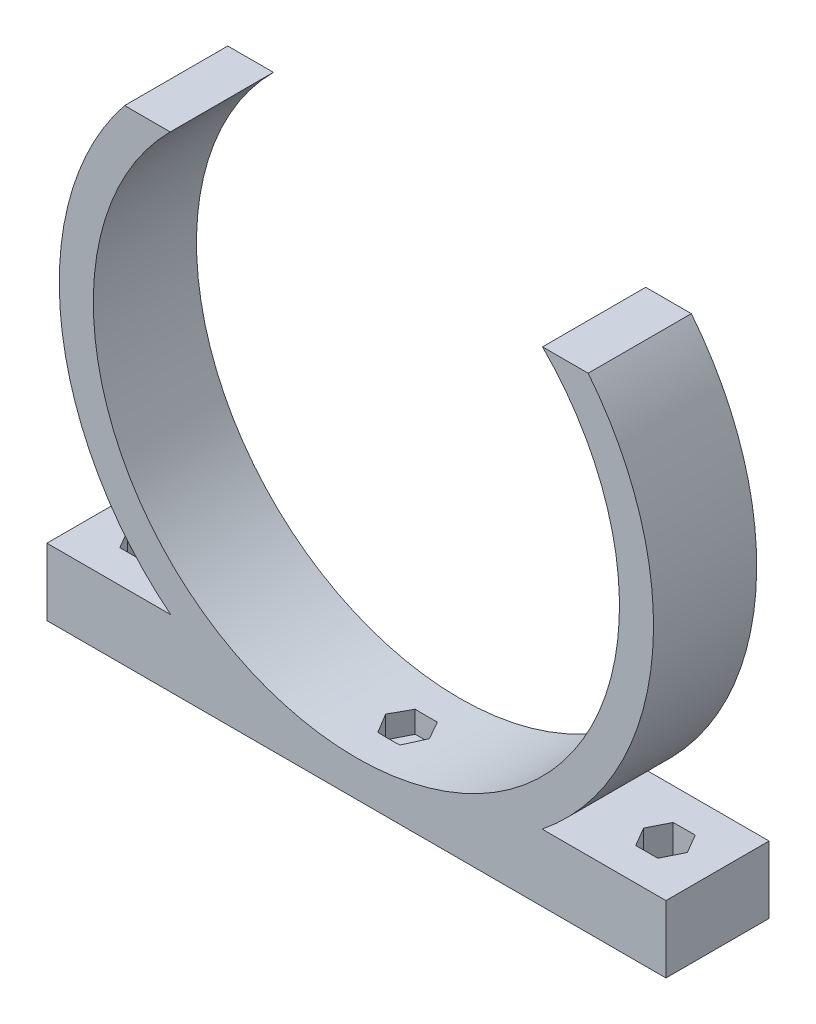
ISO-10303-21;
HEADER;
FILE_DESCRIPTION(('STEP AP214'),'2;1');
FILE_NAME('part.step','',(''),(''),'','','');
FILE_SCHEMA(('AUTOMOTIVE_DESIGN { 1 0 10303 214 1 1 1 1 }'));
ENDSEC;
DATA;
#1=APPLICATION_CONTEXT('core data for automotive mechanical design processes');
#2=APPLICATION_PROTOCOL_DEFINITION('international standard','automotive_design',2000,#1);
#3=PRODUCT_CONTEXT('',#1,'mechanical');
#4=PRODUCT('Part','Part','',(#3));
#5=PRODUCT_RELATED_PRODUCT_CATEGORY('part','',(#4));
#6=PRODUCT_DEFINITION_FORMATION('','',#4);
#7=PRODUCT_DEFINITION_CONTEXT('part definition',#1,'design');
#8=PRODUCT_DEFINITION('design','',#6,#7);
#9=PRODUCT_DEFINITION_SHAPE('','',#8);
#10=(LENGTH_UNIT() NAMED_UNIT(*) SI_UNIT(.MILLI.,.METRE.));
#11=(NAMED_UNIT(*) PLANE_ANGLE_UNIT() SI_UNIT($,.RADIAN.));
#12=(NAMED_UNIT(*) SI_UNIT($,.STERADIAN.) SOLID_ANGLE_UNIT());
#13=UNCERTAINTY_MEASURE_WITH_UNIT(LENGTH_MEASURE(1.E-05),#10,'distance_accuracy_value','');
#14=(GEOMETRIC_REPRESENTATION_CONTEXT(3) GLOBAL_UNCERTAINTY_ASSIGNED_CONTEXT((#13)) GLOBAL_UNIT_ASSIGNED_CONTEXT((#10,
#11,#12)) REPRESENTATION_CONTEXT('',''));
#15=CARTESIAN_POINT('',(0.,0.,0.));
#16=DIRECTION('',(0.,0.,1.));
#17=DIRECTION('',(1.,0.,0.));
#18=AXIS2_PLACEMENT_3D('',#15,#16,#17);
#19=CARTESIAN_POINT('',(0.,12.7,6.35));
#20=DIRECTION('',(0.,-1.,0.));
#21=DIRECTION('',(0.,0.,-1.));
#22=AXIS2_PLACEMENT_3D('',#19,#20,#21);
#23=CYLINDRICAL_SURFACE('',#22,1.27);
#24=CARTESIAN_POINT('',(0.,0.,6.35));
#25=DIRECTION('',(0.,-1.,0.));
#26=DIRECTION('',(0.,0.,-1.));
#27=AXIS2_PLACEMENT_3D('',#24,#25,#26);
#28=CIRCLE('',#27,1.27);
#29=CARTESIAN_POINT('',(0.,0.,5.08));
#30=VERTEX_POINT('',#29);
#31=EDGE_CURVE('E362',#30,#30,#28,.T.);
#32=ORIENTED_EDGE('',*,*,#31,.T.);
#33=EDGE_LOOP('',(#32));
#34=FACE_BOUND('',#33,.T.);
#35=CARTESIAN_POINT('',(0.,1.77799999999999,6.35));
#36=DIRECTION('',(0.,1.,0.));
#37=DIRECTION('',(0.,0.,1.));
#38=AXIS2_PLACEMENT_3D('',#35,#36,#37);
#39=CIRCLE('',#38,1.27);
#40=CARTESIAN_POINT('',(0.,1.77799999999999,7.62));
#41=VERTEX_POINT('',#40);
#42=EDGE_CURVE('E39',#41,#41,#39,.F.);
#43=ORIENTED_EDGE('',*,*,#42,.F.);
#44=EDGE_LOOP('',(#43));
#45=FACE_BOUND('',#44,.T.);
#46=ADVANCED_FACE('F35',(#34,#45),#23,.F.);
#47=CARTESIAN_POINT('',(0.,0.,12.7));
#48=DIRECTION('',(0.,1.,0.));
#49=DIRECTION('',(0.,0.,1.));
#50=AXIS2_PLACEMENT_3D('',#47,#48,#49);
#51=PLANE('',#50);
#52=CARTESIAN_POINT('',(-31.75,0.,6.35));
#53=DIRECTION('',(0.,-1.,0.));
#54=DIRECTION('',(0.,0.,-1.));
#55=AXIS2_PLACEMENT_3D('',#52,#53,#54);
#56=CIRCLE('',#55,1.27);
#57=CARTESIAN_POINT('',(-31.75,0.,5.08));
#58=VERTEX_POINT('',#57);
#59=EDGE_CURVE('E363',#58,#58,#56,.T.);
#60=ORIENTED_EDGE('',*,*,#59,.F.);
#61=EDGE_LOOP('',(#60));
#62=FACE_BOUND('',#61,.T.);
#63=CARTESIAN_POINT('',(31.75,0.,6.35));
#64=DIRECTION('',(0.,-1.,0.));
#65=DIRECTION('',(0.,0.,-1.));
#66=AXIS2_PLACEMENT_3D('',#63,#64,#65);
#67=CIRCLE('',#66,1.27);
#68=CARTESIAN_POINT('',(31.75,0.,5.08));
#69=VERTEX_POINT('',#68);
#70=EDGE_CURVE('E359',#69,#69,#67,.T.);
#71=ORIENTED_EDGE('',*,*,#70,.F.);
#72=EDGE_LOOP('',(#71));
#73=FACE_BOUND('',#72,.T.);
#74=ORIENTED_EDGE('',*,*,#31,.F.);
#75=EDGE_LOOP('',(#74));
#76=FACE_BOUND('',#75,.T.);
#77=DIRECTION('',(1.,0.,0.));
#78=VECTOR('',#77,1.);
#79=CARTESIAN_POINT('',(0.,0.,0.));
#80=LINE('',#79,#78);
#81=CARTESIAN_POINT('',(-38.1,0.,0.));
#82=VERTEX_POINT('',#81);
#83=CARTESIAN_POINT('',(38.1,0.,0.));
#84=VERTEX_POINT('',#83);
#85=EDGE_CURVE('E368',#82,#84,#80,.T.);
#86=ORIENTED_EDGE('',*,*,#85,.T.);
#87=DIRECTION('',(0.,0.,-1.));
#88=VECTOR('',#87,1.);
#89=CARTESIAN_POINT('',(38.1,0.,12.7));
#90=LINE('',#89,#88);
#91=CARTESIAN_POINT('',(38.1,0.,12.7));
#92=VERTEX_POINT('',#91);
#93=EDGE_CURVE('E436',#92,#84,#90,.T.);
#94=ORIENTED_EDGE('',*,*,#93,.F.);
#95=DIRECTION('',(1.,0.,0.));
#96=VECTOR('',#95,1.);
#97=CARTESIAN_POINT('',(0.,0.,12.7));
#98=LINE('',#97,#96);
#99=CARTESIAN_POINT('',(-38.1,0.,12.7));
#100=VERTEX_POINT('',#99);
#101=EDGE_CURVE('E369',#100,#92,#98,.T.);
#102=ORIENTED_EDGE('',*,*,#101,.F.);
#103=DIRECTION('',(0.,0.,-1.));
#104=VECTOR('',#103,1.);
#105=CARTESIAN_POINT('',(-38.1,0.,12.7));
#106=LINE('',#105,#104);
#107=EDGE_CURVE('E390',#100,#82,#106,.T.);
#108=ORIENTED_EDGE('',*,*,#107,.T.);
#109=EDGE_LOOP('',(#86,#94,#102,#108));
#110=FACE_BOUND('',#109,.T.);
#111=ADVANCED_FACE('F37',(#62,#73,#76,#110),#51,.F.);
#112=CARTESIAN_POINT('',(38.1,0.,12.7));
#113=DIRECTION('',(-1.,0.,0.));
#114=DIRECTION('',(0.,0.,1.));
#115=AXIS2_PLACEMENT_3D('',#112,#113,#114);
#116=PLANE('',#115);
#117=DIRECTION('',(0.,1.,0.));
#118=VECTOR('',#117,1.);
#119=CARTESIAN_POINT('',(38.1,0.,0.));
#120=LINE('',#119,#118);
#121=CARTESIAN_POINT('',(38.1,8.255,0.));
#122=VERTEX_POINT('',#121);
#123=EDGE_CURVE('E392',#84,#122,#120,.T.);
#124=ORIENTED_EDGE('',*,*,#123,.T.);
#125=DIRECTION('',(0.,0.,-1.));
#126=VECTOR('',#125,1.);
#127=CARTESIAN_POINT('',(38.1,8.255,12.7));
#128=LINE('',#127,#126);
#129=CARTESIAN_POINT('',(38.1,8.255,12.7));
#130=VERTEX_POINT('',#129);
#131=EDGE_CURVE('E433',#130,#122,#128,.T.);
#132=ORIENTED_EDGE('',*,*,#131,.F.);
#133=DIRECTION('',(0.,1.,0.));
#134=VECTOR('',#133,1.);
#135=CARTESIAN_POINT('',(38.1,0.,12.7));
#136=LINE('',#135,#134);
#137=EDGE_CURVE('E371',#92,#130,#136,.T.);
#138=ORIENTED_EDGE('',*,*,#137,.F.);
#139=ORIENTED_EDGE('',*,*,#93,.T.);
#140=EDGE_LOOP('',(#124,#132,#138,#139));
#141=FACE_BOUND('',#140,.T.);
#142=ADVANCED_FACE('F484',(#141),#116,.F.);
#143=CARTESIAN_POINT('',(38.1,8.255,12.7));
#144=DIRECTION('',(0.,-1.,0.));
#145=DIRECTION('',(1.,0.,0.));
#146=AXIS2_PLACEMENT_3D('',#143,#144,#145);
#147=PLANE('',#146);
#148=DIRECTION('',(-0.503019946630228,0.,-0.864274801953709));
#149=VECTOR('',#148,1.);
#150=CARTESIAN_POINT('',(32.9299665949111,8.255,3.91660002983049));
#151=LINE('',#150,#149);
#152=CARTESIAN_POINT('',(34.294871459593,8.255,6.2617413895544));
#153=VERTEX_POINT('',#152);
#154=CARTESIAN_POINT('',(32.9299665949111,8.255,3.91660002983049));
#155=VERTEX_POINT('',#154);
#156=EDGE_CURVE('E286',#153,#155,#151,.T.);
#157=ORIENTED_EDGE('',*,*,#156,.F.);
#158=DIRECTION('',(0.446219985080806,0.,-0.894923306722138));
#159=VECTOR('',#158,1.);
#160=CARTESIAN_POINT('',(34.294871459593,8.255,6.2617413895544));
#161=LINE('',#160,#159);
#162=CARTESIAN_POINT('',(33.0840888009029,8.255,8.6900450443998));
#163=VERTEX_POINT('',#162);
#164=EDGE_CURVE('E51',#163,#153,#161,.T.);
#165=ORIENTED_EDGE('',*,*,#164,.F.);
#166=DIRECTION('',(1.,0.,0.));
#167=VECTOR('',#166,1.);
#168=CARTESIAN_POINT('',(33.0840888009029,8.255,8.6900450443998));
#169=LINE('',#168,#167);
#170=CARTESIAN_POINT('',(30.3706678444864,8.255,8.6900450443998));
#171=VERTEX_POINT('',#170);
#172=EDGE_CURVE('E269',#171,#163,#169,.T.);
#173=ORIENTED_EDGE('',*,*,#172,.F.);
#174=DIRECTION('',(0.506233227525671,0.,0.862396613716069));
#175=VECTOR('',#174,1.);
#176=CARTESIAN_POINT('',(30.3706678444864,8.255,8.6900450443998));
#177=LINE('',#176,#175);
#178=CARTESIAN_POINT('',(28.9970439960839,8.255,6.35));
#179=VERTEX_POINT('',#178);
#180=EDGE_CURVE('E295',#179,#171,#177,.T.);
#181=ORIENTED_EDGE('',*,*,#180,.F.);
#182=DIRECTION('',(-0.449439358318454,0.,0.893310843544562));
#183=VECTOR('',#182,1.);
#184=CARTESIAN_POINT('',(28.9970439960839,8.255,6.35));
#185=LINE('',#184,#183);
#186=CARTESIAN_POINT('',(30.2165621695836,8.255,3.92607163653209));
#187=VERTEX_POINT('',#186);
#188=EDGE_CURVE('E292',#187,#179,#185,.T.);
#189=ORIENTED_EDGE('',*,*,#188,.F.);
#190=DIRECTION('',(-0.99999390765779,0.,0.00349065141521672));
#191=VECTOR('',#190,1.);
#192=CARTESIAN_POINT('',(30.2165621695836,8.255,3.92607163653209));
#193=LINE('',#192,#191);
#194=EDGE_CURVE('E289',#155,#187,#193,.T.);
#195=ORIENTED_EDGE('',*,*,#194,.F.);
#196=EDGE_LOOP('',(#157,#165,#173,#181,#189,#195));
#197=FACE_BOUND('',#196,.T.);
#198=DIRECTION('',(-1.,0.,0.));
#199=VECTOR('',#198,1.);
#200=CARTESIAN_POINT('',(38.1,8.255,0.));
#201=LINE('',#200,#199);
#202=CARTESIAN_POINT('',(22.86,8.255,0.));
#203=VERTEX_POINT('',#202);
#204=EDGE_CURVE('E394',#122,#203,#201,.T.);
#205=ORIENTED_EDGE('',*,*,#204,.T.);
#206=DIRECTION('',(0.,0.,-1.));
#207=VECTOR('',#206,1.);
#208=CARTESIAN_POINT('',(22.86,8.255,12.7));
#209=LINE('',#208,#207);
#210=CARTESIAN_POINT('',(22.86,8.255,12.7));
#211=VERTEX_POINT('',#210);
#212=EDGE_CURVE('E430',#211,#203,#209,.T.);
#213=ORIENTED_EDGE('',*,*,#212,.F.);
#214=DIRECTION('',(-1.,0.,0.));
#215=VECTOR('',#214,1.);
#216=CARTESIAN_POINT('',(38.1,8.255,12.7));
#217=LINE('',#216,#215);
#218=EDGE_CURVE('E374',#130,#211,#217,.T.);
#219=ORIENTED_EDGE('',*,*,#218,.F.);
#220=ORIENTED_EDGE('',*,*,#131,.T.);
#221=EDGE_LOOP('',(#205,#213,#219,#220));
#222=FACE_BOUND('',#221,.T.);
#223=ADVANCED_FACE('F523',(#197,#222),#147,.F.);
#224=CARTESIAN_POINT('',(-0.00316083987560688,36.8045998642709,12.7));
#225=DIRECTION('',(0.,0.,-1.));
#226=DIRECTION('',(-1.,0.,0.));
#227=AXIS2_PLACEMENT_3D('',#224,#225,#226);
#228=CYLINDRICAL_SURFACE('',#227,36.576);
#229=CARTESIAN_POINT('',(-0.00316083987560688,36.8045998642709,0.));
#230=DIRECTION('',(0.,0.,1.));
#231=DIRECTION('',(1.,0.,0.));
#232=AXIS2_PLACEMENT_3D('',#229,#230,#231);
#233=CIRCLE('',#232,36.576);
#234=CARTESIAN_POINT('',(28.5286150709851,59.69,0.));
#235=VERTEX_POINT('',#234);
#236=EDGE_CURVE('E396',#203,#235,#233,.T.);
#237=ORIENTED_EDGE('',*,*,#236,.T.);
#238=DIRECTION('',(0.,0.,-1.));
#239=VECTOR('',#238,1.);
#240=CARTESIAN_POINT('',(28.5286150709851,59.69,12.7));
#241=LINE('',#240,#239);
#242=CARTESIAN_POINT('',(28.5286150709851,59.69,12.7));
#243=VERTEX_POINT('',#242);
#244=EDGE_CURVE('E427',#243,#235,#241,.T.);
#245=ORIENTED_EDGE('',*,*,#244,.F.);
#246=CARTESIAN_POINT('',(-0.00316083987560688,36.8045998642709,12.7));
#247=DIRECTION('',(0.,0.,1.));
#248=DIRECTION('',(1.,0.,0.));
#249=AXIS2_PLACEMENT_3D('',#246,#247,#248);
#250=CIRCLE('',#249,36.576);
#251=EDGE_CURVE('E376',#211,#243,#250,.T.);
#252=ORIENTED_EDGE('',*,*,#251,.F.);
#253=ORIENTED_EDGE('',*,*,#212,.T.);
#254=EDGE_LOOP('',(#237,#245,#252,#253));
#255=FACE_BOUND('',#254,.T.);
#256=ADVANCED_FACE('F519',(#255),#228,.T.);
#257=CARTESIAN_POINT('',(22.9107363761715,59.69,12.7));
#258=DIRECTION('',(0.,-1.,0.));
#259=DIRECTION('',(0.,0.,-1.));
#260=AXIS2_PLACEMENT_3D('',#257,#258,#259);
#261=PLANE('',#260);
#262=DIRECTION('',(-1.,0.,0.));
#263=VECTOR('',#262,1.);
#264=CARTESIAN_POINT('',(22.9107363761715,59.69,0.));
#265=LINE('',#264,#263);
#266=CARTESIAN_POINT('',(22.9107363761715,59.69,0.));
#267=VERTEX_POINT('',#266);
#268=EDGE_CURVE('E398',#235,#267,#265,.T.);
#269=ORIENTED_EDGE('',*,*,#268,.T.);
#270=DIRECTION('',(0.,0.,-1.));
#271=VECTOR('',#270,1.);
#272=CARTESIAN_POINT('',(22.9107363761715,59.69,12.7));
#273=LINE('',#272,#271);
#274=CARTESIAN_POINT('',(22.9107363761715,59.69,12.7));
#275=VERTEX_POINT('',#274);
#276=EDGE_CURVE('E424',#275,#267,#273,.T.);
#277=ORIENTED_EDGE('',*,*,#276,.F.);
#278=DIRECTION('',(-1.,0.,0.));
#279=VECTOR('',#278,1.);
#280=CARTESIAN_POINT('',(22.9107363761715,59.69,12.7));
#281=LINE('',#280,#279);
#282=EDGE_CURVE('E378',#243,#275,#281,.T.);
#283=ORIENTED_EDGE('',*,*,#282,.F.);
#284=ORIENTED_EDGE('',*,*,#244,.T.);
#285=EDGE_LOOP('',(#269,#277,#283,#284));
#286=FACE_BOUND('',#285,.T.);
#287=ADVANCED_FACE('F516',(#286),#261,.F.);
#288=CARTESIAN_POINT('',(-0.00316083987560688,36.8045998642709,12.7));
#289=DIRECTION('',(0.,0.,-1.));
#290=DIRECTION('',(-1.,0.,0.));
#291=AXIS2_PLACEMENT_3D('',#288,#289,#290);
#292=CYLINDRICAL_SURFACE('',#291,32.385);
#293=CARTESIAN_POINT('',(-0.00316083987560688,36.8045998642709,1.88378356552051));
#294=DIRECTION('',(0.864274801953709,0.,-0.503019946630228));
#295=DIRECTION('',(-0.503019946630228,0.,-0.864274801953709));
#296=AXIS2_PLACEMENT_3D('',#293,#294,#295);
#297=ELLIPSE('',#296,64.3811447576776,32.385);
#298=CARTESIAN_POINT('',(1.17996659491108,4.44121879131974,3.91660002983049));
#299=VERTEX_POINT('',#298);
#300=CARTESIAN_POINT('',(2.54487145959304,4.51999430061466,6.2617413895544));
#301=VERTEX_POINT('',#300);
#302=EDGE_CURVE('E439',#299,#301,#297,.F.);
#303=ORIENTED_EDGE('',*,*,#302,.T.);
#304=CARTESIAN_POINT('',(-0.00316083987560688,36.8045998642709,11.3719864868518));
#305=DIRECTION('',(0.894923306722138,0.,0.446219985080806));
#306=DIRECTION('',(0.446219985080806,0.,-0.894923306722138));
#307=AXIS2_PLACEMENT_3D('',#304,#305,#306);
#308=ELLIPSE('',#307,72.5763100774955,32.385);
#309=CARTESIAN_POINT('',(1.33408880090293,4.4472206688194,8.6900450443998));
#310=VERTEX_POINT('',#309);
#311=EDGE_CURVE('E11',#301,#310,#308,.F.);
#312=ORIENTED_EDGE('',*,*,#311,.T.);
#313=CARTESIAN_POINT('',(-0.00316083987560688,36.8045998642709,8.6900450443998));
#314=DIRECTION('',(0.,0.,1.));
#315=DIRECTION('',(1.,0.,0.));
#316=AXIS2_PLACEMENT_3D('',#313,#314,#315);
#317=CIRCLE('',#316,32.385);
#318=CARTESIAN_POINT('',(-1.37933215551356,4.44885265438538,8.6900450443998));
#319=VERTEX_POINT('',#318);
#320=EDGE_CURVE('E44',#310,#319,#317,.F.);
#321=ORIENTED_EDGE('',*,*,#320,.T.);
#322=CARTESIAN_POINT('',(-0.00316083987560688,36.8045998642709,11.0344298416999));
#323=DIRECTION('',(-0.862396613716069,0.,0.506233227525671));
#324=DIRECTION('',(-0.506233227525671,0.,-0.862396613716069));
#325=AXIS2_PLACEMENT_3D('',#322,#323,#324);
#326=ELLIPSE('',#325,63.9724898309994,32.385);
#327=CARTESIAN_POINT('',(-2.75295600391607,4.53655295163891,6.35));
#328=VERTEX_POINT('',#327);
#329=EDGE_CURVE('E451',#319,#328,#326,.F.);
#330=ORIENTED_EDGE('',*,*,#329,.T.);
#331=CARTESIAN_POINT('',(-0.00316083987560688,36.8045998642709,0.884475470162929));
#332=DIRECTION('',(-0.893310843544562,0.,-0.449439358318454));
#333=DIRECTION('',(0.449439358318454,0.,-0.893310843544562));
#334=AXIS2_PLACEMENT_3D('',#331,#332,#333);
#335=ELLIPSE('',#334,72.0564396522063,32.385);
#336=CARTESIAN_POINT('',(-1.53343783041639,4.45577488820383,3.92607163653209));
#337=VERTEX_POINT('',#336);
#338=EDGE_CURVE('E448',#328,#337,#335,.F.);
#339=ORIENTED_EDGE('',*,*,#338,.T.);
#340=CARTESIAN_POINT('',(-0.00316083987560688,36.8045998642709,3.92072994044594));
#341=DIRECTION('',(-0.00349065141521672,0.,-0.999993907657791));
#342=DIRECTION('',(0.999993907657791,0.,-0.00349065141521672));
#343=AXIS2_PLACEMENT_3D('',#340,#341,#342);
#344=ELLIPSE('',#343,32.3851973017045,32.385);
#345=EDGE_CURVE('E445',#337,#299,#344,.F.);
#346=ORIENTED_EDGE('',*,*,#345,.T.);
#347=EDGE_LOOP('',(#303,#312,#321,#330,#339,#346));
#348=FACE_BOUND('',#347,.T.);
#349=CARTESIAN_POINT('',(-0.00316083987560688,36.8045998642709,0.));
#350=DIRECTION('',(0.,0.,-1.));
#351=DIRECTION('',(1.,0.,0.));
#352=AXIS2_PLACEMENT_3D('',#349,#350,#351);
#353=CIRCLE('',#352,32.385);
#354=CARTESIAN_POINT('',(-22.9170580559227,59.69,0.));
#355=VERTEX_POINT('',#354);
#356=EDGE_CURVE('E400',#267,#355,#353,.T.);
#357=ORIENTED_EDGE('',*,*,#356,.T.);
#358=DIRECTION('',(0.,0.,-1.));
#359=VECTOR('',#358,1.);
#360=CARTESIAN_POINT('',(-22.9170580559227,59.69,12.7));
#361=LINE('',#360,#359);
#362=CARTESIAN_POINT('',(-22.9170580559227,59.69,12.7));
#363=VERTEX_POINT('',#362);
#364=EDGE_CURVE('E421',#363,#355,#361,.T.);
#365=ORIENTED_EDGE('',*,*,#364,.F.);
#366=CARTESIAN_POINT('',(-0.00316083987560688,36.8045998642709,12.7));
#367=DIRECTION('',(0.,0.,-1.));
#368=DIRECTION('',(1.,0.,0.));
#369=AXIS2_PLACEMENT_3D('',#366,#367,#368);
#370=CIRCLE('',#369,32.385);
#371=EDGE_CURVE('E380',#275,#363,#370,.T.);
#372=ORIENTED_EDGE('',*,*,#371,.F.);
#373=ORIENTED_EDGE('',*,*,#276,.T.);
#374=EDGE_LOOP('',(#357,#365,#372,#373));
#375=FACE_BOUND('',#374,.T.);
#376=ADVANCED_FACE('F456',(#348,#375),#292,.F.);
#377=CARTESIAN_POINT('',(-28.5349367507363,59.69,12.7));
#378=DIRECTION('',(0.,-1.,0.));
#379=DIRECTION('',(0.,0.,-1.));
#380=AXIS2_PLACEMENT_3D('',#377,#378,#379);
#381=PLANE('',#380);
#382=DIRECTION('',(-1.,0.,0.));
#383=VECTOR('',#382,1.);
#384=CARTESIAN_POINT('',(-28.5349367507363,59.69,0.));
#385=LINE('',#384,#383);
#386=CARTESIAN_POINT('',(-28.5349367507363,59.69,0.));
#387=VERTEX_POINT('',#386);
#388=EDGE_CURVE('E402',#355,#387,#385,.T.);
#389=ORIENTED_EDGE('',*,*,#388,.T.);
#390=DIRECTION('',(0.,0.,-1.));
#391=VECTOR('',#390,1.);
#392=CARTESIAN_POINT('',(-28.5349367507363,59.69,12.7));
#393=LINE('',#392,#391);
#394=CARTESIAN_POINT('',(-28.5349367507363,59.69,12.7));
#395=VERTEX_POINT('',#394);
#396=EDGE_CURVE('E418',#395,#387,#393,.T.);
#397=ORIENTED_EDGE('',*,*,#396,.F.);
#398=DIRECTION('',(-1.,0.,0.));
#399=VECTOR('',#398,1.);
#400=CARTESIAN_POINT('',(-28.5349367507363,59.69,12.7));
#401=LINE('',#400,#399);
#402=EDGE_CURVE('E382',#363,#395,#401,.T.);
#403=ORIENTED_EDGE('',*,*,#402,.F.);
#404=ORIENTED_EDGE('',*,*,#364,.T.);
#405=EDGE_LOOP('',(#389,#397,#403,#404));
#406=FACE_BOUND('',#405,.T.);
#407=ADVANCED_FACE('F509',(#406),#381,.F.);
#408=CARTESIAN_POINT('',(-0.00316083987560688,36.8045998642709,12.7));
#409=DIRECTION('',(0.,0.,-1.));
#410=DIRECTION('',(-1.,0.,0.));
#411=AXIS2_PLACEMENT_3D('',#408,#409,#410);
#412=CYLINDRICAL_SURFACE('',#411,36.576);
#413=CARTESIAN_POINT('',(-0.00316083987560688,36.8045998642709,0.));
#414=DIRECTION('',(0.,0.,1.));
#415=DIRECTION('',(1.,0.,0.));
#416=AXIS2_PLACEMENT_3D('',#413,#414,#415);
#417=CIRCLE('',#416,36.576);
#418=CARTESIAN_POINT('',(-22.8663216797512,8.255,0.));
#419=VERTEX_POINT('',#418);
#420=EDGE_CURVE('E404',#387,#419,#417,.T.);
#421=ORIENTED_EDGE('',*,*,#420,.T.);
#422=DIRECTION('',(0.,0.,-1.));
#423=VECTOR('',#422,1.);
#424=CARTESIAN_POINT('',(-22.8663216797512,8.255,12.7));
#425=LINE('',#424,#423);
#426=CARTESIAN_POINT('',(-22.8663216797512,8.255,12.7));
#427=VERTEX_POINT('',#426);
#428=EDGE_CURVE('E415',#427,#419,#425,.T.);
#429=ORIENTED_EDGE('',*,*,#428,.F.);
#430=CARTESIAN_POINT('',(-0.00316083987560688,36.8045998642709,12.7));
#431=DIRECTION('',(0.,0.,1.));
#432=DIRECTION('',(1.,0.,0.));
#433=AXIS2_PLACEMENT_3D('',#430,#431,#432);
#434=CIRCLE('',#433,36.576);
#435=EDGE_CURVE('E384',#395,#427,#434,.T.);
#436=ORIENTED_EDGE('',*,*,#435,.F.);
#437=ORIENTED_EDGE('',*,*,#396,.T.);
#438=EDGE_LOOP('',(#421,#429,#436,#437));
#439=FACE_BOUND('',#438,.T.);
#440=ADVANCED_FACE('F505',(#439),#412,.T.);
#441=CARTESIAN_POINT('',(-38.1,8.255,12.7));
#442=DIRECTION('',(0.,-1.,0.));
#443=DIRECTION('',(0.,0.,-1.));
#444=AXIS2_PLACEMENT_3D('',#441,#442,#443);
#445=PLANE('',#444);
#446=DIRECTION('',(-0.503019946630228,0.,-0.864274801953709));
#447=VECTOR('',#446,1.);
#448=CARTESIAN_POINT('',(-30.5700334050889,8.255,3.91660002983049));
#449=LINE('',#448,#447);
#450=CARTESIAN_POINT('',(-29.205128540407,8.255,6.2617413895544));
#451=VERTEX_POINT('',#450);
#452=CARTESIAN_POINT('',(-30.5700334050889,8.255,3.91660002983049));
#453=VERTEX_POINT('',#452);
#454=EDGE_CURVE('E332',#451,#453,#449,.T.);
#455=ORIENTED_EDGE('',*,*,#454,.F.);
#456=DIRECTION('',(0.446219985080806,0.,-0.894923306722138));
#457=VECTOR('',#456,1.);
#458=CARTESIAN_POINT('',(-29.205128540407,8.255,6.2617413895544));
#459=LINE('',#458,#457);
#460=CARTESIAN_POINT('',(-30.4159111990971,8.255,8.6900450443998));
#461=VERTEX_POINT('',#460);
#462=EDGE_CURVE('E330',#461,#451,#459,.T.);
#463=ORIENTED_EDGE('',*,*,#462,.F.);
#464=DIRECTION('',(1.,0.,0.));
#465=VECTOR('',#464,1.);
#466=CARTESIAN_POINT('',(-30.4159111990971,8.255,8.6900450443998));
#467=LINE('',#466,#465);
#468=CARTESIAN_POINT('',(-33.1293321555136,8.255,8.6900450443998));
#469=VERTEX_POINT('',#468);
#470=EDGE_CURVE('E314',#469,#461,#467,.T.);
#471=ORIENTED_EDGE('',*,*,#470,.F.);
#472=DIRECTION('',(0.506233227525671,0.,0.862396613716069));
#473=VECTOR('',#472,1.);
#474=CARTESIAN_POINT('',(-33.1293321555136,8.255,8.6900450443998));
#475=LINE('',#474,#473);
#476=CARTESIAN_POINT('',(-34.5029560039161,8.255,6.35));
#477=VERTEX_POINT('',#476);
#478=EDGE_CURVE('E341',#477,#469,#475,.T.);
#479=ORIENTED_EDGE('',*,*,#478,.F.);
#480=DIRECTION('',(-0.449439358318454,0.,0.893310843544562));
#481=VECTOR('',#480,1.);
#482=CARTESIAN_POINT('',(-34.5029560039161,8.255,6.35));
#483=LINE('',#482,#481);
#484=CARTESIAN_POINT('',(-33.2834378304164,8.255,3.92607163653209));
#485=VERTEX_POINT('',#484);
#486=EDGE_CURVE('E338',#485,#477,#483,.T.);
#487=ORIENTED_EDGE('',*,*,#486,.F.);
#488=DIRECTION('',(-0.99999390765779,0.,0.00349065141521672));
#489=VECTOR('',#488,1.);
#490=CARTESIAN_POINT('',(-33.2834378304164,8.255,3.92607163653209));
#491=LINE('',#490,#489);
#492=EDGE_CURVE('E335',#453,#485,#491,.T.);
#493=ORIENTED_EDGE('',*,*,#492,.F.);
#494=EDGE_LOOP('',(#455,#463,#471,#479,#487,#493));
#495=FACE_BOUND('',#494,.T.);
#496=DIRECTION('',(-1.,0.,0.));
#497=VECTOR('',#496,1.);
#498=CARTESIAN_POINT('',(-38.1,8.255,0.));
#499=LINE('',#498,#497);
#500=CARTESIAN_POINT('',(-38.1,8.255,0.));
#501=VERTEX_POINT('',#500);
#502=EDGE_CURVE('E406',#419,#501,#499,.T.);
#503=ORIENTED_EDGE('',*,*,#502,.T.);
#504=DIRECTION('',(0.,0.,-1.));
#505=VECTOR('',#504,1.);
#506=CARTESIAN_POINT('',(-38.1,8.255,12.7));
#507=LINE('',#506,#505);
#508=CARTESIAN_POINT('',(-38.1,8.255,12.7));
#509=VERTEX_POINT('',#508);
#510=EDGE_CURVE('E412',#509,#501,#507,.T.);
#511=ORIENTED_EDGE('',*,*,#510,.F.);
#512=DIRECTION('',(-1.,0.,0.));
#513=VECTOR('',#512,1.);
#514=CARTESIAN_POINT('',(-38.1,8.255,12.7));
#515=LINE('',#514,#513);
#516=EDGE_CURVE('E386',#427,#509,#515,.T.);
#517=ORIENTED_EDGE('',*,*,#516,.F.);
#518=ORIENTED_EDGE('',*,*,#428,.T.);
#519=EDGE_LOOP('',(#503,#511,#517,#518));
#520=FACE_BOUND('',#519,.T.);
#521=ADVANCED_FACE('F501',(#495,#520),#445,.F.);
#522=CARTESIAN_POINT('',(-38.1,0.,12.7));
#523=DIRECTION('',(1.,0.,0.));
#524=DIRECTION('',(0.,0.,-1.));
#525=AXIS2_PLACEMENT_3D('',#522,#523,#524);
#526=PLANE('',#525);
#527=DIRECTION('',(0.,-1.,0.));
#528=VECTOR('',#527,1.);
#529=CARTESIAN_POINT('',(-38.1,0.,0.));
#530=LINE('',#529,#528);
#531=EDGE_CURVE('E372',#501,#82,#530,.T.);
#532=ORIENTED_EDGE('',*,*,#531,.T.);
#533=ORIENTED_EDGE('',*,*,#107,.F.);
#534=DIRECTION('',(0.,-1.,0.));
#535=VECTOR('',#534,1.);
#536=CARTESIAN_POINT('',(-38.1,0.,12.7));
#537=LINE('',#536,#535);
#538=EDGE_CURVE('E388',#509,#100,#537,.T.);
#539=ORIENTED_EDGE('',*,*,#538,.F.);
#540=ORIENTED_EDGE('',*,*,#510,.T.);
#541=EDGE_LOOP('',(#532,#533,#539,#540));
#542=FACE_BOUND('',#541,.T.);
#543=ADVANCED_FACE('F495',(#542),#526,.F.);
#544=CARTESIAN_POINT('',(-0.00316083987560688,36.8045998642709,12.7));
#545=DIRECTION('',(0.,0.,1.));
#546=DIRECTION('',(1.,0.,0.));
#547=AXIS2_PLACEMENT_3D('',#544,#545,#546);
#548=PLANE('',#547);
#549=ORIENTED_EDGE('',*,*,#101,.T.);
#550=ORIENTED_EDGE('',*,*,#137,.T.);
#551=ORIENTED_EDGE('',*,*,#218,.T.);
#552=ORIENTED_EDGE('',*,*,#251,.T.);
#553=ORIENTED_EDGE('',*,*,#282,.T.);
#554=ORIENTED_EDGE('',*,*,#371,.T.);
#555=ORIENTED_EDGE('',*,*,#402,.T.);
#556=ORIENTED_EDGE('',*,*,#435,.T.);
#557=ORIENTED_EDGE('',*,*,#516,.T.);
#558=ORIENTED_EDGE('',*,*,#538,.T.);
#559=EDGE_LOOP('',(#549,#550,#551,#552,#553,#554,#555,#556,#557,#558));
#560=FACE_BOUND('',#559,.T.);
#561=ADVANCED_FACE('F491',(#560),#548,.T.);
#562=CARTESIAN_POINT('',(-0.00316083987560688,36.8045998642709,0.));
#563=DIRECTION('',(0.,0.,1.));
#564=DIRECTION('',(1.,0.,0.));
#565=AXIS2_PLACEMENT_3D('',#562,#563,#564);
#566=PLANE('',#565);
#567=ORIENTED_EDGE('',*,*,#85,.F.);
#568=ORIENTED_EDGE('',*,*,#531,.F.);
#569=ORIENTED_EDGE('',*,*,#502,.F.);
#570=ORIENTED_EDGE('',*,*,#420,.F.);
#571=ORIENTED_EDGE('',*,*,#388,.F.);
#572=ORIENTED_EDGE('',*,*,#356,.F.);
#573=ORIENTED_EDGE('',*,*,#268,.F.);
#574=ORIENTED_EDGE('',*,*,#236,.F.);
#575=ORIENTED_EDGE('',*,*,#204,.F.);
#576=ORIENTED_EDGE('',*,*,#123,.F.);
#577=EDGE_LOOP('',(#567,#568,#569,#570,#571,#572,#573,#574,#575,#576));
#578=FACE_BOUND('',#577,.T.);
#579=ADVANCED_FACE('F494',(#578),#566,.F.);
#580=CARTESIAN_POINT('',(-31.75,12.7,6.35));
#581=DIRECTION('',(0.,-1.,0.));
#582=DIRECTION('',(0.,0.,-1.));
#583=AXIS2_PLACEMENT_3D('',#580,#581,#582);
#584=CYLINDRICAL_SURFACE('',#583,1.27);
#585=CARTESIAN_POINT('',(-31.75,4.318,6.35));
#586=DIRECTION('',(0.,-1.,0.));
#587=DIRECTION('',(0.,0.,-1.));
#588=AXIS2_PLACEMENT_3D('',#585,#586,#587);
#589=CIRCLE('',#588,1.27);
#590=CARTESIAN_POINT('',(-31.75,4.318,5.08));
#591=VERTEX_POINT('',#590);
#592=EDGE_CURVE('E348',#591,#591,#589,.F.);
#593=ORIENTED_EDGE('',*,*,#592,.T.);
#594=EDGE_LOOP('',(#593));
#595=FACE_BOUND('',#594,.T.);
#596=ORIENTED_EDGE('',*,*,#59,.T.);
#597=EDGE_LOOP('',(#596));
#598=FACE_BOUND('',#597,.T.);
#599=ADVANCED_FACE('F489',(#595,#598),#584,.F.);
#600=CARTESIAN_POINT('',(31.75,12.7,6.35));
#601=DIRECTION('',(0.,-1.,0.));
#602=DIRECTION('',(0.,0.,-1.));
#603=AXIS2_PLACEMENT_3D('',#600,#601,#602);
#604=CYLINDRICAL_SURFACE('',#603,1.27);
#605=CARTESIAN_POINT('',(31.75,4.318,6.35));
#606=DIRECTION('',(0.,-1.,0.));
#607=DIRECTION('',(0.,0.,-1.));
#608=AXIS2_PLACEMENT_3D('',#605,#606,#607);
#609=CIRCLE('',#608,1.27);
#610=CARTESIAN_POINT('',(31.75,4.318,5.08));
#611=VERTEX_POINT('',#610);
#612=EDGE_CURVE('E254',#611,#611,#609,.F.);
#613=ORIENTED_EDGE('',*,*,#612,.T.);
#614=EDGE_LOOP('',(#613));
#615=FACE_BOUND('',#614,.T.);
#616=ORIENTED_EDGE('',*,*,#70,.T.);
#617=EDGE_LOOP('',(#616));
#618=FACE_BOUND('',#617,.T.);
#619=ADVANCED_FACE('F627',(#615,#618),#604,.F.);
#620=CARTESIAN_POINT('',(0.,4.318,0.));
#621=DIRECTION('',(0.,-1.,0.));
#622=DIRECTION('',(0.,0.,-1.));
#623=AXIS2_PLACEMENT_3D('',#620,#621,#622);
#624=PLANE('',#623);
#625=DIRECTION('',(0.446219985080806,0.,-0.894923306722138));
#626=VECTOR('',#625,1.);
#627=CARTESIAN_POINT('',(-29.205128540407,4.318,6.2617413895544));
#628=LINE('',#627,#626);
#629=CARTESIAN_POINT('',(-30.4159111990971,4.318,8.6900450443998));
#630=VERTEX_POINT('',#629);
#631=CARTESIAN_POINT('',(-29.205128540407,4.318,6.2617413895544));
#632=VERTEX_POINT('',#631);
#633=EDGE_CURVE('E310',#630,#632,#628,.T.);
#634=ORIENTED_EDGE('',*,*,#633,.T.);
#635=DIRECTION('',(-0.503019946630228,0.,-0.864274801953709));
#636=VECTOR('',#635,1.);
#637=CARTESIAN_POINT('',(-30.5700334050889,4.318,3.91660002983049));
#638=LINE('',#637,#636);
#639=CARTESIAN_POINT('',(-30.5700334050889,4.318,3.91660002983049));
#640=VERTEX_POINT('',#639);
#641=EDGE_CURVE('E313',#632,#640,#638,.T.);
#642=ORIENTED_EDGE('',*,*,#641,.T.);
#643=DIRECTION('',(-0.99999390765779,0.,0.00349065141521672));
#644=VECTOR('',#643,1.);
#645=CARTESIAN_POINT('',(-33.2834378304164,4.318,3.92607163653209));
#646=LINE('',#645,#644);
#647=CARTESIAN_POINT('',(-33.2834378304164,4.318,3.92607163653209));
#648=VERTEX_POINT('',#647);
#649=EDGE_CURVE('E317',#640,#648,#646,.T.);
#650=ORIENTED_EDGE('',*,*,#649,.T.);
#651=DIRECTION('',(-0.449439358318454,0.,0.893310843544562));
#652=VECTOR('',#651,1.);
#653=CARTESIAN_POINT('',(-34.5029560039161,4.318,6.35));
#654=LINE('',#653,#652);
#655=CARTESIAN_POINT('',(-34.5029560039161,4.318,6.35));
#656=VERTEX_POINT('',#655);
#657=EDGE_CURVE('E320',#648,#656,#654,.T.);
#658=ORIENTED_EDGE('',*,*,#657,.T.);
#659=DIRECTION('',(0.506233227525671,0.,0.862396613716069));
#660=VECTOR('',#659,1.);
#661=CARTESIAN_POINT('',(-33.1293321555136,4.318,8.6900450443998));
#662=LINE('',#661,#660);
#663=CARTESIAN_POINT('',(-33.1293321555136,4.318,8.6900450443998));
#664=VERTEX_POINT('',#663);
#665=EDGE_CURVE('E323',#656,#664,#662,.T.);
#666=ORIENTED_EDGE('',*,*,#665,.T.);
#667=DIRECTION('',(1.,0.,0.));
#668=VECTOR('',#667,1.);
#669=CARTESIAN_POINT('',(-30.4159111990971,4.318,8.6900450443998));
#670=LINE('',#669,#668);
#671=EDGE_CURVE('E326',#664,#630,#670,.T.);
#672=ORIENTED_EDGE('',*,*,#671,.T.);
#673=EDGE_LOOP('',(#634,#642,#650,#658,#666,#672));
#674=FACE_BOUND('',#673,.T.);
#675=ORIENTED_EDGE('',*,*,#592,.F.);
#676=EDGE_LOOP('',(#675));
#677=FACE_BOUND('',#676,.T.);
#678=ADVANCED_FACE('F635',(#674,#677),#624,.F.);
#679=CARTESIAN_POINT('',(-29.205128540407,4.318,6.2617413895544));
#680=DIRECTION('',(0.894923306722138,0.,0.446219985080806));
#681=DIRECTION('',(0.446219985080806,0.,-0.894923306722138));
#682=AXIS2_PLACEMENT_3D('',#679,#680,#681);
#683=PLANE('',#682);
#684=ORIENTED_EDGE('',*,*,#462,.T.);
#685=DIRECTION('',(0.,1.,0.));
#686=VECTOR('',#685,1.);
#687=CARTESIAN_POINT('',(-29.205128540407,4.318,6.2617413895544));
#688=LINE('',#687,#686);
#689=EDGE_CURVE('E329',#632,#451,#688,.T.);
#690=ORIENTED_EDGE('',*,*,#689,.F.);
#691=ORIENTED_EDGE('',*,*,#633,.F.);
#692=DIRECTION('',(0.,1.,0.));
#693=VECTOR('',#692,1.);
#694=CARTESIAN_POINT('',(-30.4159111990971,4.318,8.6900450443998));
#695=LINE('',#694,#693);
#696=EDGE_CURVE('E346',#630,#461,#695,.T.);
#697=ORIENTED_EDGE('',*,*,#696,.T.);
#698=EDGE_LOOP('',(#684,#690,#691,#697));
#699=FACE_BOUND('',#698,.T.);
#700=ADVANCED_FACE('F643',(#699),#683,.F.);
#701=CARTESIAN_POINT('',(-30.4159111990971,4.318,8.6900450443998));
#702=DIRECTION('',(0.,0.,1.));
#703=DIRECTION('',(1.,0.,0.));
#704=AXIS2_PLACEMENT_3D('',#701,#702,#703);
#705=PLANE('',#704);
#706=ORIENTED_EDGE('',*,*,#470,.T.);
#707=ORIENTED_EDGE('',*,*,#696,.F.);
#708=ORIENTED_EDGE('',*,*,#671,.F.);
#709=DIRECTION('',(0.,1.,0.));
#710=VECTOR('',#709,1.);
#711=CARTESIAN_POINT('',(-33.1293321555136,4.318,8.6900450443998));
#712=LINE('',#711,#710);
#713=EDGE_CURVE('E349',#664,#469,#712,.T.);
#714=ORIENTED_EDGE('',*,*,#713,.T.);
#715=EDGE_LOOP('',(#706,#707,#708,#714));
#716=FACE_BOUND('',#715,.T.);
#717=ADVANCED_FACE('F652',(#716),#705,.F.);
#718=CARTESIAN_POINT('',(-33.1293321555136,4.318,8.6900450443998));
#719=DIRECTION('',(-0.862396613716069,0.,0.506233227525671));
#720=DIRECTION('',(0.506233227525671,0.,0.862396613716069));
#721=AXIS2_PLACEMENT_3D('',#718,#719,#720);
#722=PLANE('',#721);
#723=ORIENTED_EDGE('',*,*,#478,.T.);
#724=ORIENTED_EDGE('',*,*,#713,.F.);
#725=ORIENTED_EDGE('',*,*,#665,.F.);
#726=DIRECTION('',(0.,1.,0.));
#727=VECTOR('',#726,1.);
#728=CARTESIAN_POINT('',(-34.5029560039161,4.318,6.35));
#729=LINE('',#728,#727);
#730=EDGE_CURVE('E351',#656,#477,#729,.T.);
#731=ORIENTED_EDGE('',*,*,#730,.T.);
#732=EDGE_LOOP('',(#723,#724,#725,#731));
#733=FACE_BOUND('',#732,.T.);
#734=ADVANCED_FACE('F661',(#733),#722,.F.);
#735=CARTESIAN_POINT('',(-34.5029560039161,4.318,6.35));
#736=DIRECTION('',(-0.893310843544562,0.,-0.449439358318454));
#737=DIRECTION('',(-0.449439358318454,0.,0.893310843544562));
#738=AXIS2_PLACEMENT_3D('',#735,#736,#737);
#739=PLANE('',#738);
#740=ORIENTED_EDGE('',*,*,#486,.T.);
#741=ORIENTED_EDGE('',*,*,#730,.F.);
#742=ORIENTED_EDGE('',*,*,#657,.F.);
#743=DIRECTION('',(0.,1.,0.));
#744=VECTOR('',#743,1.);
#745=CARTESIAN_POINT('',(-33.2834378304164,4.318,3.92607163653209));
#746=LINE('',#745,#744);
#747=EDGE_CURVE('E353',#648,#485,#746,.T.);
#748=ORIENTED_EDGE('',*,*,#747,.T.);
#749=EDGE_LOOP('',(#740,#741,#742,#748));
#750=FACE_BOUND('',#749,.T.);
#751=ADVANCED_FACE('F670',(#750),#739,.F.);
#752=CARTESIAN_POINT('',(-33.2834378304164,4.318,3.92607163653209));
#753=DIRECTION('',(-0.00349065141521672,0.,-0.999993907657791));
#754=DIRECTION('',(-0.99999390765779,0.,0.00349065141521672));
#755=AXIS2_PLACEMENT_3D('',#752,#753,#754);
#756=PLANE('',#755);
#757=ORIENTED_EDGE('',*,*,#492,.T.);
#758=ORIENTED_EDGE('',*,*,#747,.F.);
#759=ORIENTED_EDGE('',*,*,#649,.F.);
#760=DIRECTION('',(0.,1.,0.));
#761=VECTOR('',#760,1.);
#762=CARTESIAN_POINT('',(-30.5700334050889,4.318,3.91660002983049));
#763=LINE('',#762,#761);
#764=EDGE_CURVE('E355',#640,#453,#763,.T.);
#765=ORIENTED_EDGE('',*,*,#764,.T.);
#766=EDGE_LOOP('',(#757,#758,#759,#765));
#767=FACE_BOUND('',#766,.T.);
#768=ADVANCED_FACE('F679',(#767),#756,.F.);
#769=CARTESIAN_POINT('',(-30.5700334050889,4.318,3.91660002983049));
#770=DIRECTION('',(0.864274801953709,0.,-0.503019946630228));
#771=DIRECTION('',(-0.503019946630228,0.,-0.864274801953709));
#772=AXIS2_PLACEMENT_3D('',#769,#770,#771);
#773=PLANE('',#772);
#774=ORIENTED_EDGE('',*,*,#454,.T.);
#775=ORIENTED_EDGE('',*,*,#764,.F.);
#776=ORIENTED_EDGE('',*,*,#641,.F.);
#777=ORIENTED_EDGE('',*,*,#689,.T.);
#778=EDGE_LOOP('',(#774,#775,#776,#777));
#779=FACE_BOUND('',#778,.T.);
#780=ADVANCED_FACE('F688',(#779),#773,.F.);
#781=CARTESIAN_POINT('',(63.5,4.318,0.));
#782=DIRECTION('',(0.,-1.,0.));
#783=DIRECTION('',(0.,0.,-1.));
#784=AXIS2_PLACEMENT_3D('',#781,#782,#783);
#785=PLANE('',#784);
#786=DIRECTION('',(0.446219985080806,0.,-0.894923306722138));
#787=VECTOR('',#786,1.);
#788=CARTESIAN_POINT('',(34.294871459593,4.318,6.2617413895544));
#789=LINE('',#788,#787);
#790=CARTESIAN_POINT('',(33.0840888009029,4.318,8.6900450443998));
#791=VERTEX_POINT('',#790);
#792=CARTESIAN_POINT('',(34.294871459593,4.318,6.2617413895544));
#793=VERTEX_POINT('',#792);
#794=EDGE_CURVE('E265',#791,#793,#789,.T.);
#795=ORIENTED_EDGE('',*,*,#794,.T.);
#796=DIRECTION('',(-0.503019946630228,0.,-0.864274801953709));
#797=VECTOR('',#796,1.);
#798=CARTESIAN_POINT('',(32.9299665949111,4.318,3.91660002983049));
#799=LINE('',#798,#797);
#800=CARTESIAN_POINT('',(32.9299665949111,4.318,3.91660002983049));
#801=VERTEX_POINT('',#800);
#802=EDGE_CURVE('E268',#793,#801,#799,.T.);
#803=ORIENTED_EDGE('',*,*,#802,.T.);
#804=DIRECTION('',(-0.99999390765779,0.,0.00349065141521672));
#805=VECTOR('',#804,1.);
#806=CARTESIAN_POINT('',(30.2165621695836,4.318,3.92607163653209));
#807=LINE('',#806,#805);
#808=CARTESIAN_POINT('',(30.2165621695836,4.318,3.92607163653209));
#809=VERTEX_POINT('',#808);
#810=EDGE_CURVE('E272',#801,#809,#807,.T.);
#811=ORIENTED_EDGE('',*,*,#810,.T.);
#812=DIRECTION('',(-0.449439358318454,0.,0.893310843544562));
#813=VECTOR('',#812,1.);
#814=CARTESIAN_POINT('',(28.9970439960839,4.318,6.35));
#815=LINE('',#814,#813);
#816=CARTESIAN_POINT('',(28.9970439960839,4.318,6.35));
#817=VERTEX_POINT('',#816);
#818=EDGE_CURVE('E275',#809,#817,#815,.T.);
#819=ORIENTED_EDGE('',*,*,#818,.T.);
#820=DIRECTION('',(0.506233227525671,0.,0.862396613716069));
#821=VECTOR('',#820,1.);
#822=CARTESIAN_POINT('',(30.3706678444864,4.318,8.6900450443998));
#823=LINE('',#822,#821);
#824=CARTESIAN_POINT('',(30.3706678444864,4.318,8.6900450443998));
#825=VERTEX_POINT('',#824);
#826=EDGE_CURVE('E278',#817,#825,#823,.T.);
#827=ORIENTED_EDGE('',*,*,#826,.T.);
#828=DIRECTION('',(1.,0.,0.));
#829=VECTOR('',#828,1.);
#830=CARTESIAN_POINT('',(33.0840888009029,4.318,8.6900450443998));
#831=LINE('',#830,#829);
#832=EDGE_CURVE('E281',#825,#791,#831,.T.);
#833=ORIENTED_EDGE('',*,*,#832,.T.);
#834=EDGE_LOOP('',(#795,#803,#811,#819,#827,#833));
#835=FACE_BOUND('',#834,.T.);
#836=ORIENTED_EDGE('',*,*,#612,.F.);
#837=EDGE_LOOP('',(#836));
#838=FACE_BOUND('',#837,.T.);
#839=ADVANCED_FACE('F696',(#835,#838),#785,.F.);
#840=CARTESIAN_POINT('',(34.294871459593,4.318,6.2617413895544));
#841=DIRECTION('',(0.894923306722138,0.,0.446219985080806));
#842=DIRECTION('',(0.446219985080806,0.,-0.894923306722138));
#843=AXIS2_PLACEMENT_3D('',#840,#841,#842);
#844=PLANE('',#843);
#845=ORIENTED_EDGE('',*,*,#164,.T.);
#846=DIRECTION('',(0.,1.,0.));
#847=VECTOR('',#846,1.);
#848=CARTESIAN_POINT('',(34.294871459593,4.318,6.2617413895544));
#849=LINE('',#848,#847);
#850=EDGE_CURVE('E284',#793,#153,#849,.T.);
#851=ORIENTED_EDGE('',*,*,#850,.F.);
#852=ORIENTED_EDGE('',*,*,#794,.F.);
#853=DIRECTION('',(0.,1.,0.));
#854=VECTOR('',#853,1.);
#855=CARTESIAN_POINT('',(33.0840888009029,4.318,8.6900450443998));
#856=LINE('',#855,#854);
#857=EDGE_CURVE('E227',#791,#163,#856,.T.);
#858=ORIENTED_EDGE('',*,*,#857,.T.);
#859=EDGE_LOOP('',(#845,#851,#852,#858));
#860=FACE_BOUND('',#859,.T.);
#861=ADVANCED_FACE('F704',(#860),#844,.F.);
#862=CARTESIAN_POINT('',(33.0840888009029,4.318,8.6900450443998));
#863=DIRECTION('',(0.,0.,1.));
#864=DIRECTION('',(1.,0.,0.));
#865=AXIS2_PLACEMENT_3D('',#862,#863,#864);
#866=PLANE('',#865);
#867=ORIENTED_EDGE('',*,*,#172,.T.);
#868=ORIENTED_EDGE('',*,*,#857,.F.);
#869=ORIENTED_EDGE('',*,*,#832,.F.);
#870=DIRECTION('',(0.,1.,0.));
#871=VECTOR('',#870,1.);
#872=CARTESIAN_POINT('',(30.3706678444864,4.318,8.6900450443998));
#873=LINE('',#872,#871);
#874=EDGE_CURVE('E301',#825,#171,#873,.T.);
#875=ORIENTED_EDGE('',*,*,#874,.T.);
#876=EDGE_LOOP('',(#867,#868,#869,#875));
#877=FACE_BOUND('',#876,.T.);
#878=ADVANCED_FACE('F713',(#877),#866,.F.);
#879=CARTESIAN_POINT('',(30.3706678444864,4.318,8.6900450443998));
#880=DIRECTION('',(-0.862396613716069,0.,0.506233227525671));
#881=DIRECTION('',(0.506233227525671,0.,0.862396613716069));
#882=AXIS2_PLACEMENT_3D('',#879,#880,#881);
#883=PLANE('',#882);
#884=ORIENTED_EDGE('',*,*,#180,.T.);
#885=ORIENTED_EDGE('',*,*,#874,.F.);
#886=ORIENTED_EDGE('',*,*,#826,.F.);
#887=DIRECTION('',(0.,1.,0.));
#888=VECTOR('',#887,1.);
#889=CARTESIAN_POINT('',(28.9970439960839,4.318,6.35));
#890=LINE('',#889,#888);
#891=EDGE_CURVE('E303',#817,#179,#890,.T.);
#892=ORIENTED_EDGE('',*,*,#891,.T.);
#893=EDGE_LOOP('',(#884,#885,#886,#892));
#894=FACE_BOUND('',#893,.T.);
#895=ADVANCED_FACE('F721',(#894),#883,.F.);
#896=CARTESIAN_POINT('',(28.9970439960839,4.318,6.35));
#897=DIRECTION('',(-0.893310843544562,0.,-0.449439358318454));
#898=DIRECTION('',(-0.449439358318454,0.,0.893310843544562));
#899=AXIS2_PLACEMENT_3D('',#896,#897,#898);
#900=PLANE('',#899);
#901=ORIENTED_EDGE('',*,*,#188,.T.);
#902=ORIENTED_EDGE('',*,*,#891,.F.);
#903=ORIENTED_EDGE('',*,*,#818,.F.);
#904=DIRECTION('',(0.,1.,0.));
#905=VECTOR('',#904,1.);
#906=CARTESIAN_POINT('',(30.2165621695836,4.318,3.92607163653209));
#907=LINE('',#906,#905);
#908=EDGE_CURVE('E305',#809,#187,#907,.T.);
#909=ORIENTED_EDGE('',*,*,#908,.T.);
#910=EDGE_LOOP('',(#901,#902,#903,#909));
#911=FACE_BOUND('',#910,.T.);
#912=ADVANCED_FACE('F730',(#911),#900,.F.);
#913=CARTESIAN_POINT('',(30.2165621695836,4.318,3.92607163653209));
#914=DIRECTION('',(-0.00349065141521672,0.,-0.999993907657791));
#915=DIRECTION('',(-0.99999390765779,0.,0.00349065141521672));
#916=AXIS2_PLACEMENT_3D('',#913,#914,#915);
#917=PLANE('',#916);
#918=ORIENTED_EDGE('',*,*,#194,.T.);
#919=ORIENTED_EDGE('',*,*,#908,.F.);
#920=ORIENTED_EDGE('',*,*,#810,.F.);
#921=DIRECTION('',(0.,1.,0.));
#922=VECTOR('',#921,1.);
#923=CARTESIAN_POINT('',(32.9299665949111,4.318,3.91660002983049));
#924=LINE('',#923,#922);
#925=EDGE_CURVE('E307',#801,#155,#924,.T.);
#926=ORIENTED_EDGE('',*,*,#925,.T.);
#927=EDGE_LOOP('',(#918,#919,#920,#926));
#928=FACE_BOUND('',#927,.T.);
#929=ADVANCED_FACE('F739',(#928),#917,.F.);
#930=CARTESIAN_POINT('',(32.9299665949111,4.318,3.91660002983049));
#931=DIRECTION('',(0.864274801953709,0.,-0.503019946630228));
#932=DIRECTION('',(-0.503019946630228,0.,-0.864274801953709));
#933=AXIS2_PLACEMENT_3D('',#930,#931,#932);
#934=PLANE('',#933);
#935=ORIENTED_EDGE('',*,*,#156,.T.);
#936=ORIENTED_EDGE('',*,*,#925,.F.);
#937=ORIENTED_EDGE('',*,*,#802,.F.);
#938=ORIENTED_EDGE('',*,*,#850,.T.);
#939=EDGE_LOOP('',(#935,#936,#937,#938));
#940=FACE_BOUND('',#939,.T.);
#941=ADVANCED_FACE('F748',(#940),#934,.F.);
#942=CARTESIAN_POINT('',(2.54487145959304,4.318,6.2617413895544));
#943=DIRECTION('',(0.894923306722138,0.,0.446219985080806));
#944=DIRECTION('',(0.446219985080806,0.,-0.894923306722138));
#945=AXIS2_PLACEMENT_3D('',#942,#943,#944);
#946=PLANE('',#945);
#947=DIRECTION('',(0.,1.,0.));
#948=VECTOR('',#947,1.);
#949=CARTESIAN_POINT('',(2.54487145959304,4.318,6.2617413895544));
#950=LINE('',#949,#948);
#951=CARTESIAN_POINT('',(2.54487145959304,1.778,6.2617413895544));
#952=VERTEX_POINT('',#951);
#953=EDGE_CURVE('E59',#952,#301,#950,.T.);
#954=ORIENTED_EDGE('',*,*,#953,.F.);
#955=DIRECTION('',(0.446219985080806,0.,-0.894923306722138));
#956=VECTOR('',#955,1.);
#957=CARTESIAN_POINT('',(1.33408880090293,1.778,8.6900450443998));
#958=LINE('',#957,#956);
#959=CARTESIAN_POINT('',(1.33408880090293,1.778,8.6900450443998));
#960=VERTEX_POINT('',#959);
#961=EDGE_CURVE('E223',#960,#952,#958,.T.);
#962=ORIENTED_EDGE('',*,*,#961,.F.);
#963=DIRECTION('',(0.,1.,0.));
#964=VECTOR('',#963,1.);
#965=CARTESIAN_POINT('',(1.33408880090293,4.318,8.6900450443998));
#966=LINE('',#965,#964);
#967=EDGE_CURVE('E252',#960,#310,#966,.T.);
#968=ORIENTED_EDGE('',*,*,#967,.T.);
#969=ORIENTED_EDGE('',*,*,#311,.F.);
#970=EDGE_LOOP('',(#954,#962,#968,#969));
#971=FACE_BOUND('',#970,.T.);
#972=ADVANCED_FACE('F220',(#971),#946,.F.);
#973=CARTESIAN_POINT('',(1.33408880090293,4.318,8.6900450443998));
#974=DIRECTION('',(0.,0.,1.));
#975=DIRECTION('',(1.,0.,0.));
#976=AXIS2_PLACEMENT_3D('',#973,#974,#975);
#977=PLANE('',#976);
#978=ORIENTED_EDGE('',*,*,#967,.F.);
#979=DIRECTION('',(1.,0.,0.));
#980=VECTOR('',#979,1.);
#981=CARTESIAN_POINT('',(1.33408880090293,1.778,8.6900450443998));
#982=LINE('',#981,#980);
#983=CARTESIAN_POINT('',(-1.37933215551356,1.778,8.6900450443998));
#984=VERTEX_POINT('',#983);
#985=EDGE_CURVE('E242',#984,#960,#982,.T.);
#986=ORIENTED_EDGE('',*,*,#985,.F.);
#987=DIRECTION('',(0.,1.,0.));
#988=VECTOR('',#987,1.);
#989=CARTESIAN_POINT('',(-1.37933215551356,4.318,8.6900450443998));
#990=LINE('',#989,#988);
#991=EDGE_CURVE('E255',#984,#319,#990,.T.);
#992=ORIENTED_EDGE('',*,*,#991,.T.);
#993=ORIENTED_EDGE('',*,*,#320,.F.);
#994=EDGE_LOOP('',(#978,#986,#992,#993));
#995=FACE_BOUND('',#994,.T.);
#996=ADVANCED_FACE('F459',(#995),#977,.F.);
#997=CARTESIAN_POINT('',(-1.37933215551356,4.318,8.6900450443998));
#998=DIRECTION('',(-0.862396613716069,0.,0.506233227525671));
#999=DIRECTION('',(0.506233227525671,0.,0.862396613716069));
#1000=AXIS2_PLACEMENT_3D('',#997,#998,#999);
#1001=PLANE('',#1000);
#1002=ORIENTED_EDGE('',*,*,#991,.F.);
#1003=DIRECTION('',(0.506233227525671,0.,0.862396613716069));
#1004=VECTOR('',#1003,1.);
#1005=CARTESIAN_POINT('',(-2.75295600391607,1.778,6.35));
#1006=LINE('',#1005,#1004);
#1007=CARTESIAN_POINT('',(-2.75295600391607,1.778,6.35));
#1008=VERTEX_POINT('',#1007);
#1009=EDGE_CURVE('E249',#1008,#984,#1006,.T.);
#1010=ORIENTED_EDGE('',*,*,#1009,.F.);
#1011=DIRECTION('',(0.,1.,0.));
#1012=VECTOR('',#1011,1.);
#1013=CARTESIAN_POINT('',(-2.75295600391607,4.318,6.35));
#1014=LINE('',#1013,#1012);
#1015=EDGE_CURVE('E258',#1008,#328,#1014,.T.);
#1016=ORIENTED_EDGE('',*,*,#1015,.T.);
#1017=ORIENTED_EDGE('',*,*,#329,.F.);
#1018=EDGE_LOOP('',(#1002,#1010,#1016,#1017));
#1019=FACE_BOUND('',#1018,.T.);
#1020=ADVANCED_FACE('F462',(#1019),#1001,.F.);
#1021=CARTESIAN_POINT('',(-2.75295600391607,4.318,6.35));
#1022=DIRECTION('',(-0.893310843544562,0.,-0.449439358318454));
#1023=DIRECTION('',(-0.449439358318454,0.,0.893310843544562));
#1024=AXIS2_PLACEMENT_3D('',#1021,#1022,#1023);
#1025=PLANE('',#1024);
#1026=ORIENTED_EDGE('',*,*,#1015,.F.);
#1027=DIRECTION('',(-0.449439358318454,0.,0.893310843544562));
#1028=VECTOR('',#1027,1.);
#1029=CARTESIAN_POINT('',(-1.53343783041639,1.778,3.92607163653209));
#1030=LINE('',#1029,#1028);
#1031=CARTESIAN_POINT('',(-1.53343783041639,1.778,3.92607163653209));
#1032=VERTEX_POINT('',#1031);
#1033=EDGE_CURVE('E246',#1032,#1008,#1030,.T.);
#1034=ORIENTED_EDGE('',*,*,#1033,.F.);
#1035=DIRECTION('',(0.,1.,0.));
#1036=VECTOR('',#1035,1.);
#1037=CARTESIAN_POINT('',(-1.53343783041639,4.318,3.92607163653209));
#1038=LINE('',#1037,#1036);
#1039=EDGE_CURVE('E261',#1032,#337,#1038,.T.);
#1040=ORIENTED_EDGE('',*,*,#1039,.T.);
#1041=ORIENTED_EDGE('',*,*,#338,.F.);
#1042=EDGE_LOOP('',(#1026,#1034,#1040,#1041));
#1043=FACE_BOUND('',#1042,.T.);
#1044=ADVANCED_FACE('F465',(#1043),#1025,.F.);
#1045=CARTESIAN_POINT('',(-1.53343783041639,4.318,3.92607163653209));
#1046=DIRECTION('',(-0.00349065141521672,0.,-0.999993907657791));
#1047=DIRECTION('',(-0.99999390765779,0.,0.00349065141521672));
#1048=AXIS2_PLACEMENT_3D('',#1045,#1046,#1047);
#1049=PLANE('',#1048);
#1050=ORIENTED_EDGE('',*,*,#1039,.F.);
#1051=DIRECTION('',(-0.99999390765779,0.,0.00349065141521672));
#1052=VECTOR('',#1051,1.);
#1053=CARTESIAN_POINT('',(-1.53343783041639,1.778,3.92607163653209));
#1054=LINE('',#1053,#1052);
#1055=CARTESIAN_POINT('',(1.17996659491108,1.778,3.91660002983049));
#1056=VERTEX_POINT('',#1055);
#1057=EDGE_CURVE('E236',#1056,#1032,#1054,.T.);
#1058=ORIENTED_EDGE('',*,*,#1057,.F.);
#1059=DIRECTION('',(0.,1.,0.));
#1060=VECTOR('',#1059,1.);
#1061=CARTESIAN_POINT('',(1.17996659491108,4.318,3.91660002983049));
#1062=LINE('',#1061,#1060);
#1063=EDGE_CURVE('E226',#1056,#299,#1062,.T.);
#1064=ORIENTED_EDGE('',*,*,#1063,.T.);
#1065=ORIENTED_EDGE('',*,*,#345,.F.);
#1066=EDGE_LOOP('',(#1050,#1058,#1064,#1065));
#1067=FACE_BOUND('',#1066,.T.);
#1068=ADVANCED_FACE('F467',(#1067),#1049,.F.);
#1069=CARTESIAN_POINT('',(1.17996659491108,4.318,3.91660002983049));
#1070=DIRECTION('',(0.864274801953709,0.,-0.503019946630228));
#1071=DIRECTION('',(-0.503019946630228,0.,-0.864274801953709));
#1072=AXIS2_PLACEMENT_3D('',#1069,#1070,#1071);
#1073=PLANE('',#1072);
#1074=ORIENTED_EDGE('',*,*,#1063,.F.);
#1075=DIRECTION('',(-0.503019946630228,0.,-0.864274801953709));
#1076=VECTOR('',#1075,1.);
#1077=CARTESIAN_POINT('',(1.17996659491108,1.778,3.91660002983049));
#1078=LINE('',#1077,#1076);
#1079=EDGE_CURVE('E230',#952,#1056,#1078,.T.);
#1080=ORIENTED_EDGE('',*,*,#1079,.F.);
#1081=ORIENTED_EDGE('',*,*,#953,.T.);
#1082=ORIENTED_EDGE('',*,*,#302,.F.);
#1083=EDGE_LOOP('',(#1074,#1080,#1081,#1082));
#1084=FACE_BOUND('',#1083,.T.);
#1085=ADVANCED_FACE('F231',(#1084),#1073,.F.);
#1086=CARTESIAN_POINT('',(0.,1.778,0.));
#1087=DIRECTION('',(0.,1.,0.));
#1088=DIRECTION('',(0.,0.,1.));
#1089=AXIS2_PLACEMENT_3D('',#1086,#1087,#1088);
#1090=PLANE('',#1089);
#1091=ORIENTED_EDGE('',*,*,#961,.T.);
#1092=ORIENTED_EDGE('',*,*,#1079,.T.);
#1093=ORIENTED_EDGE('',*,*,#1057,.T.);
#1094=ORIENTED_EDGE('',*,*,#1033,.T.);
#1095=ORIENTED_EDGE('',*,*,#1009,.T.);
#1096=ORIENTED_EDGE('',*,*,#985,.T.);
#1097=EDGE_LOOP('',(#1091,#1092,#1093,#1094,#1095,#1096));
#1098=FACE_BOUND('',#1097,.T.);
#1099=ORIENTED_EDGE('',*,*,#42,.T.);
#1100=EDGE_LOOP('',(#1099));
#1101=FACE_BOUND('',#1100,.T.);
#1102=ADVANCED_FACE('F238',(#1098,#1101),#1090,.T.);
#1103=CLOSED_SHELL('',(#46,#111,#142,#223,#256,#287,#376,#407,#440,#521,#543,#561,#579,#599,
#619,#678,#700,#717,#734,#751,#768,#780,#839,#861,#878,#895,#912,#929,#941,#972,#996,#1020,
#1044,#1068,#1085,#1102));
#1104=MANIFOLD_SOLID_BREP('B2',#1103);
#1105=ADVANCED_BREP_SHAPE_REPRESENTATION('',(#18,#1104),#14);
#1106=SHAPE_DEFINITION_REPRESENTATION(#9,#1105);
ENDSEC;
END-ISO-10303-21;
